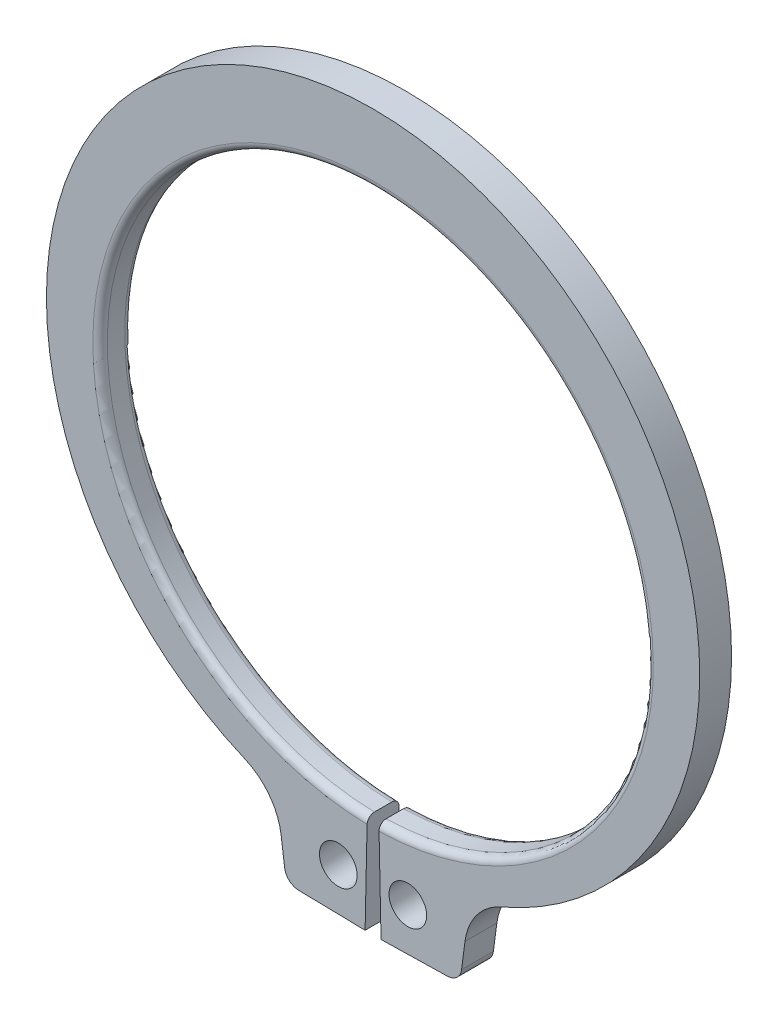
ISO-10303-21;
HEADER;
FILE_DESCRIPTION(('STEP AP214'),'2;1');
FILE_NAME('part.step','',(''),(''),'','','');
FILE_SCHEMA(('AUTOMOTIVE_DESIGN { 1 0 10303 214 1 1 1 1 }'));
ENDSEC;
DATA;
#1=APPLICATION_CONTEXT('core data for automotive mechanical design processes');
#2=APPLICATION_PROTOCOL_DEFINITION('international standard','automotive_design',2000,#1);
#3=PRODUCT_CONTEXT('',#1,'mechanical');
#4=PRODUCT('Part','Part','',(#3));
#5=PRODUCT_RELATED_PRODUCT_CATEGORY('part','',(#4));
#6=PRODUCT_DEFINITION_FORMATION('','',#4);
#7=PRODUCT_DEFINITION_CONTEXT('part definition',#1,'design');
#8=PRODUCT_DEFINITION('design','',#6,#7);
#9=PRODUCT_DEFINITION_SHAPE('','',#8);
#10=(LENGTH_UNIT() NAMED_UNIT(*) SI_UNIT(.MILLI.,.METRE.));
#11=(NAMED_UNIT(*) PLANE_ANGLE_UNIT() SI_UNIT($,.RADIAN.));
#12=(NAMED_UNIT(*) SI_UNIT($,.STERADIAN.) SOLID_ANGLE_UNIT());
#13=UNCERTAINTY_MEASURE_WITH_UNIT(LENGTH_MEASURE(1.E-05),#10,'distance_accuracy_value','');
#14=(GEOMETRIC_REPRESENTATION_CONTEXT(3) GLOBAL_UNCERTAINTY_ASSIGNED_CONTEXT((#13)) GLOBAL_UNIT_ASSIGNED_CONTEXT((#10,
#11,#12)) REPRESENTATION_CONTEXT('',''));
#15=CARTESIAN_POINT('',(0.,0.,0.));
#16=DIRECTION('',(0.,0.,1.));
#17=DIRECTION('',(1.,0.,0.));
#18=AXIS2_PLACEMENT_3D('',#15,#16,#17);
#19=CARTESIAN_POINT('',(0.626976767648557,0.778446285086579,-1.26977994725239));
#20=DIRECTION('',(0.,0.,1.));
#21=DIRECTION('',(1.,0.,0.));
#22=AXIS2_PLACEMENT_3D('',#19,#20,#21);
#23=CYLINDRICAL_SURFACE('',#22,9.425);
#24=DIRECTION('',(0.,0.,1.));
#25=VECTOR('',#24,1.);
#26=CARTESIAN_POINT('',(0.425666088036907,-8.64440354977094,-1.26977994725239));
#27=LINE('',#26,#25);
#28=CARTESIAN_POINT('',(0.425666088036907,-8.64440354977094,-1.01977994725239));
#29=VERTEX_POINT('',#28);
#30=CARTESIAN_POINT('',(0.425666088036907,-8.64440354977094,-0.419779947252391));
#31=VERTEX_POINT('',#30);
#32=EDGE_CURVE('E228',#29,#31,#27,.T.);
#33=ORIENTED_EDGE('',*,*,#32,.F.);
#34=CARTESIAN_POINT('',(0.626976767648557,0.778446285086579,-1.01977994725239));
#35=DIRECTION('',(0.,0.,1.));
#36=DIRECTION('',(1.,0.,0.));
#37=AXIS2_PLACEMENT_3D('',#34,#35,#36);
#38=CIRCLE('',#37,9.425);
#39=CARTESIAN_POINT('',(0.828287447260208,-8.64440354977094,-1.01977994725239));
#40=VERTEX_POINT('',#39);
#41=EDGE_CURVE('E251',#29,#40,#38,.F.);
#42=ORIENTED_EDGE('',*,*,#41,.T.);
#43=DIRECTION('',(0.,0.,1.));
#44=VECTOR('',#43,1.);
#45=CARTESIAN_POINT('',(0.828287447260208,-8.64440354977094,-1.26977994725239));
#46=LINE('',#45,#44);
#47=CARTESIAN_POINT('',(0.828287447260208,-8.64440354977094,-0.419779947252391));
#48=VERTEX_POINT('',#47);
#49=EDGE_CURVE('E165',#40,#48,#46,.T.);
#50=ORIENTED_EDGE('',*,*,#49,.T.);
#51=CARTESIAN_POINT('',(0.626976767648557,0.778446285086579,-0.419779947252391));
#52=DIRECTION('',(0.,0.,1.));
#53=DIRECTION('',(1.,0.,0.));
#54=AXIS2_PLACEMENT_3D('',#51,#52,#53);
#55=CIRCLE('',#54,9.425);
#56=EDGE_CURVE('E230',#48,#31,#55,.T.);
#57=ORIENTED_EDGE('',*,*,#56,.T.);
#58=EDGE_LOOP('',(#33,#42,#50,#57));
#59=FACE_BOUND('',#58,.T.);
#60=ADVANCED_FACE('F43',(#59),#23,.F.);
#61=CARTESIAN_POINT('',(0.425666088036907,-8.64440354977094,-1.26977994725239));
#62=DIRECTION('',(0.999771865767376,-0.0213592233009709,0.));
#63=DIRECTION('',(0.0213592233009709,0.999771865767376,0.));
#64=AXIS2_PLACEMENT_3D('',#61,#62,#63);
#65=PLANE('',#64);
#66=DIRECTION('',(0.0213592233009709,0.999771865767376,0.));
#67=VECTOR('',#66,1.);
#68=CARTESIAN_POINT('',(0.425666088036907,-8.64440354977094,-1.26977994725239));
#69=LINE('',#68,#67);
#70=CARTESIAN_POINT('',(0.351976767648557,-12.0936164866684,-1.26977994725239));
#71=VERTEX_POINT('',#70);
#72=CARTESIAN_POINT('',(0.420326282211664,-8.89434651621278,-1.26977994725239));
#73=VERTEX_POINT('',#72);
#74=EDGE_CURVE('E197',#71,#73,#69,.T.);
#75=ORIENTED_EDGE('',*,*,#74,.T.);
#76=CARTESIAN_POINT('',(0.420326282211664,-8.89434651621278,-1.01977994725239));
#77=DIRECTION('',(0.999771865767376,-0.0213592233009709,0.));
#78=DIRECTION('',(0.0213592233009709,0.999771865767376,0.));
#79=AXIS2_PLACEMENT_3D('',#76,#77,#78);
#80=CIRCLE('',#79,0.25);
#81=EDGE_CURVE('E51',#73,#29,#80,.T.);
#82=ORIENTED_EDGE('',*,*,#81,.T.);
#83=ORIENTED_EDGE('',*,*,#32,.T.);
#84=CARTESIAN_POINT('',(0.420326282211664,-8.89434651621278,-0.419779947252391));
#85=DIRECTION('',(0.999771865767376,-0.0213592233009709,0.));
#86=DIRECTION('',(0.0213592233009709,0.999771865767376,0.));
#87=AXIS2_PLACEMENT_3D('',#84,#85,#86);
#88=CIRCLE('',#87,0.25);
#89=CARTESIAN_POINT('',(0.420326282211664,-8.89434651621278,-0.169779947252391));
#90=VERTEX_POINT('',#89);
#91=EDGE_CURVE('E58',#31,#90,#88,.T.);
#92=ORIENTED_EDGE('',*,*,#91,.T.);
#93=DIRECTION('',(0.0213592233009709,0.999771865767376,0.));
#94=VECTOR('',#93,1.);
#95=CARTESIAN_POINT('',(0.425666088036907,-8.64440354977094,-0.169779947252391));
#96=LINE('',#95,#94);
#97=CARTESIAN_POINT('',(0.351976767648557,-12.0936164866684,-0.169779947252391));
#98=VERTEX_POINT('',#97);
#99=EDGE_CURVE('E157',#98,#90,#96,.T.);
#100=ORIENTED_EDGE('',*,*,#99,.F.);
#101=DIRECTION('',(0.,0.,1.));
#102=VECTOR('',#101,1.);
#103=CARTESIAN_POINT('',(0.351976767648557,-12.0936164866684,-1.26977994725239));
#104=LINE('',#103,#102);
#105=EDGE_CURVE('E231',#71,#98,#104,.T.);
#106=ORIENTED_EDGE('',*,*,#105,.F.);
#107=EDGE_LOOP('',(#75,#82,#83,#92,#100,#106));
#108=FACE_BOUND('',#107,.T.);
#109=ADVANCED_FACE('F260',(#108),#65,.T.);
#110=CARTESIAN_POINT('',(0.351976767648557,-12.0936164866684,-1.26977994725239));
#111=DIRECTION('',(-0.0213592233009698,-0.999771865767376,0.));
#112=DIRECTION('',(0.999771865767376,-0.0213592233009698,0.));
#113=AXIS2_PLACEMENT_3D('',#110,#111,#112);
#114=PLANE('',#113);
#115=DIRECTION('',(0.999771865767376,-0.0213592233009698,0.));
#116=VECTOR('',#115,1.);
#117=CARTESIAN_POINT('',(0.351976767648557,-12.0936164866684,-0.169779947252391));
#118=LINE('',#117,#116);
#119=CARTESIAN_POINT('',(-1.94180009482106,-12.0446120148627,-0.169779947252391));
#120=VERTEX_POINT('',#119);
#121=EDGE_CURVE('E224',#120,#98,#118,.T.);
#122=ORIENTED_EDGE('',*,*,#121,.F.);
#123=DIRECTION('',(0.,0.,1.));
#124=VECTOR('',#123,1.);
#125=CARTESIAN_POINT('',(-1.94180009482106,-12.0446120148627,-1.26977994725239));
#126=LINE('',#125,#124);
#127=CARTESIAN_POINT('',(-1.94180009482106,-12.0446120148627,-1.26977994725239));
#128=VERTEX_POINT('',#127);
#129=EDGE_CURVE('E233',#128,#120,#126,.T.);
#130=ORIENTED_EDGE('',*,*,#129,.F.);
#131=DIRECTION('',(0.999771865767376,-0.0213592233009698,0.));
#132=VECTOR('',#131,1.);
#133=CARTESIAN_POINT('',(0.351976767648557,-12.0936164866684,-1.26977994725239));
#134=LINE('',#133,#132);
#135=EDGE_CURVE('E194',#128,#71,#134,.T.);
#136=ORIENTED_EDGE('',*,*,#135,.T.);
#137=ORIENTED_EDGE('',*,*,#105,.T.);
#138=EDGE_LOOP('',(#122,#130,#136,#137));
#139=FACE_BOUND('',#138,.T.);
#140=ADVANCED_FACE('F283',(#139),#114,.T.);
#141=CARTESIAN_POINT('',(-1.93112048317058,-11.544726081979,-1.26977994725239));
#142=DIRECTION('',(0.,0.,1.));
#143=DIRECTION('',(1.,0.,0.));
#144=AXIS2_PLACEMENT_3D('',#141,#142,#143);
#145=CYLINDRICAL_SURFACE('',#144,0.499999999999999);
#146=CARTESIAN_POINT('',(-1.93112048317058,-11.544726081979,-0.169779947252391));
#147=DIRECTION('',(0.,0.,1.));
#148=DIRECTION('',(1.,0.,0.));
#149=AXIS2_PLACEMENT_3D('',#146,#147,#148);
#150=CIRCLE('',#149,0.499999999999999);
#151=CARTESIAN_POINT('',(-2.42684291385748,-11.6099891780891,-0.169779947252391));
#152=VERTEX_POINT('',#151);
#153=EDGE_CURVE('E221',#152,#120,#150,.T.);
#154=ORIENTED_EDGE('',*,*,#153,.F.);
#155=DIRECTION('',(0.,0.,1.));
#156=VECTOR('',#155,1.);
#157=CARTESIAN_POINT('',(-2.42684291385748,-11.6099891780891,-1.26977994725239));
#158=LINE('',#157,#156);
#159=CARTESIAN_POINT('',(-2.42684291385748,-11.6099891780891,-1.26977994725239));
#160=VERTEX_POINT('',#159);
#161=EDGE_CURVE('E235',#160,#152,#158,.T.);
#162=ORIENTED_EDGE('',*,*,#161,.F.);
#163=CARTESIAN_POINT('',(-1.93112048317058,-11.544726081979,-1.26977994725239));
#164=DIRECTION('',(0.,0.,1.));
#165=DIRECTION('',(1.,0.,0.));
#166=AXIS2_PLACEMENT_3D('',#163,#164,#165);
#167=CIRCLE('',#166,0.499999999999999);
#168=EDGE_CURVE('E191',#160,#128,#167,.T.);
#169=ORIENTED_EDGE('',*,*,#168,.T.);
#170=ORIENTED_EDGE('',*,*,#129,.T.);
#171=EDGE_LOOP('',(#154,#162,#169,#170));
#172=FACE_BOUND('',#171,.T.);
#173=ADVANCED_FACE('F313',(#172),#145,.T.);
#174=CARTESIAN_POINT('',(-2.54649092636189,-10.7011722950294,-1.26977994725239));
#175=DIRECTION('',(-0.99144486137381,-0.130526192220053,0.));
#176=DIRECTION('',(0.130526192220053,-0.99144486137381,0.));
#177=AXIS2_PLACEMENT_3D('',#174,#175,#176);
#178=PLANE('',#177);
#179=DIRECTION('',(0.130526192220053,-0.99144486137381,0.));
#180=VECTOR('',#179,1.);
#181=CARTESIAN_POINT('',(-2.54649092636189,-10.7011722950294,-0.169779947252391));
#182=LINE('',#181,#180);
#183=CARTESIAN_POINT('',(-2.54649092636189,-10.7011722950294,-0.169779947252391));
#184=VERTEX_POINT('',#183);
#185=EDGE_CURVE('E218',#184,#152,#182,.T.);
#186=ORIENTED_EDGE('',*,*,#185,.F.);
#187=DIRECTION('',(0.,0.,1.));
#188=VECTOR('',#187,1.);
#189=CARTESIAN_POINT('',(-2.54649092636189,-10.7011722950294,-1.26977994725239));
#190=LINE('',#189,#188);
#191=CARTESIAN_POINT('',(-2.54649092636189,-10.7011722950294,-1.26977994725239));
#192=VERTEX_POINT('',#191);
#193=EDGE_CURVE('E237',#192,#184,#190,.T.);
#194=ORIENTED_EDGE('',*,*,#193,.F.);
#195=DIRECTION('',(0.130526192220053,-0.99144486137381,0.));
#196=VECTOR('',#195,1.);
#197=CARTESIAN_POINT('',(-2.54649092636189,-10.7011722950294,-1.26977994725239));
#198=LINE('',#197,#196);
#199=EDGE_CURVE('E188',#192,#160,#198,.T.);
#200=ORIENTED_EDGE('',*,*,#199,.T.);
#201=ORIENTED_EDGE('',*,*,#161,.T.);
#202=EDGE_LOOP('',(#186,#194,#200,#201));
#203=FACE_BOUND('',#202,.T.);
#204=ADVANCED_FACE('F309',(#203),#178,.T.);
#205=CARTESIAN_POINT('',(-4.6281801757392,-10.9752318839107,-1.26977994725239));
#206=DIRECTION('',(0.,0.,1.));
#207=DIRECTION('',(1.,0.,0.));
#208=AXIS2_PLACEMENT_3D('',#205,#206,#207);
#209=CYLINDRICAL_SURFACE('',#208,2.09965206385032);
#210=CARTESIAN_POINT('',(-4.6281801757392,-10.9752318839107,-0.169779947252391));
#211=DIRECTION('',(0.,0.,-1.));
#212=DIRECTION('',(1.,0.,0.));
#213=AXIS2_PLACEMENT_3D('',#210,#211,#212);
#214=CIRCLE('',#213,2.09965206385032);
#215=CARTESIAN_POINT('',(-3.80332579314655,-9.04438905324101,-0.169779947252391));
#216=VERTEX_POINT('',#215);
#217=EDGE_CURVE('E215',#216,#184,#214,.T.);
#218=ORIENTED_EDGE('',*,*,#217,.F.);
#219=DIRECTION('',(0.,0.,1.));
#220=VECTOR('',#219,1.);
#221=CARTESIAN_POINT('',(-3.80332579314655,-9.04438905324101,-1.26977994725239));
#222=LINE('',#221,#220);
#223=CARTESIAN_POINT('',(-3.80332579314655,-9.04438905324101,-1.26977994725239));
#224=VERTEX_POINT('',#223);
#225=EDGE_CURVE('E239',#224,#216,#222,.T.);
#226=ORIENTED_EDGE('',*,*,#225,.F.);
#227=CARTESIAN_POINT('',(-4.6281801757392,-10.9752318839107,-1.26977994725239));
#228=DIRECTION('',(0.,0.,-1.));
#229=DIRECTION('',(1.,0.,0.));
#230=AXIS2_PLACEMENT_3D('',#227,#228,#229);
#231=CIRCLE('',#230,2.09965206385032);
#232=EDGE_CURVE('E185',#224,#192,#231,.T.);
#233=ORIENTED_EDGE('',*,*,#232,.T.);
#234=ORIENTED_EDGE('',*,*,#193,.T.);
#235=EDGE_LOOP('',(#218,#226,#233,#234));
#236=FACE_BOUND('',#235,.T.);
#237=ADVANCED_FACE('F305',(#236),#209,.F.);
#238=CARTESIAN_POINT('',(0.626976767648557,1.32619043052378,-1.26977994725239));
#239=DIRECTION('',(0.,0.,1.));
#240=DIRECTION('',(1.,0.,0.));
#241=AXIS2_PLACEMENT_3D('',#238,#239,#240);
#242=CYLINDRICAL_SURFACE('',#241,11.2772558545628);
#243=CARTESIAN_POINT('',(0.626976767648557,1.32619043052378,-0.169779947252391));
#244=DIRECTION('',(0.,0.,1.));
#245=DIRECTION('',(1.,0.,0.));
#246=AXIS2_PLACEMENT_3D('',#243,#244,#245);
#247=CIRCLE('',#246,11.2772558545628);
#248=CARTESIAN_POINT('',(5.05727932844366,-9.04438905324101,-0.169779947252391));
#249=VERTEX_POINT('',#248);
#250=EDGE_CURVE('E212',#249,#216,#247,.T.);
#251=ORIENTED_EDGE('',*,*,#250,.F.);
#252=DIRECTION('',(0.,0.,1.));
#253=VECTOR('',#252,1.);
#254=CARTESIAN_POINT('',(5.05727932844366,-9.04438905324101,-1.26977994725239));
#255=LINE('',#254,#253);
#256=CARTESIAN_POINT('',(5.05727932844366,-9.04438905324101,-1.26977994725239));
#257=VERTEX_POINT('',#256);
#258=EDGE_CURVE('E241',#257,#249,#255,.T.);
#259=ORIENTED_EDGE('',*,*,#258,.F.);
#260=CARTESIAN_POINT('',(0.626976767648557,1.32619043052378,-1.26977994725239));
#261=DIRECTION('',(0.,0.,1.));
#262=DIRECTION('',(1.,0.,0.));
#263=AXIS2_PLACEMENT_3D('',#260,#261,#262);
#264=CIRCLE('',#263,11.2772558545628);
#265=EDGE_CURVE('E182',#257,#224,#264,.T.);
#266=ORIENTED_EDGE('',*,*,#265,.T.);
#267=ORIENTED_EDGE('',*,*,#225,.T.);
#268=EDGE_LOOP('',(#251,#259,#266,#267));
#269=FACE_BOUND('',#268,.T.);
#270=ADVANCED_FACE('F301',(#269),#242,.T.);
#271=CARTESIAN_POINT('',(5.88213371103631,-10.9752318839107,-1.26977994725239));
#272=DIRECTION('',(0.,0.,1.));
#273=DIRECTION('',(1.,0.,0.));
#274=AXIS2_PLACEMENT_3D('',#271,#272,#273);
#275=CYLINDRICAL_SURFACE('',#274,2.09965206385032);
#276=CARTESIAN_POINT('',(5.88213371103631,-10.9752318839107,-0.169779947252391));
#277=DIRECTION('',(0.,0.,-1.));
#278=DIRECTION('',(1.,0.,0.));
#279=AXIS2_PLACEMENT_3D('',#276,#277,#278);
#280=CIRCLE('',#279,2.09965206385032);
#281=CARTESIAN_POINT('',(3.800444461659,-10.7011722950294,-0.169779947252391));
#282=VERTEX_POINT('',#281);
#283=EDGE_CURVE('E209',#282,#249,#280,.T.);
#284=ORIENTED_EDGE('',*,*,#283,.F.);
#285=DIRECTION('',(0.,0.,1.));
#286=VECTOR('',#285,1.);
#287=CARTESIAN_POINT('',(3.800444461659,-10.7011722950294,-1.26977994725239));
#288=LINE('',#287,#286);
#289=CARTESIAN_POINT('',(3.800444461659,-10.7011722950294,-1.26977994725239));
#290=VERTEX_POINT('',#289);
#291=EDGE_CURVE('E243',#290,#282,#288,.T.);
#292=ORIENTED_EDGE('',*,*,#291,.F.);
#293=CARTESIAN_POINT('',(5.88213371103631,-10.9752318839107,-1.26977994725239));
#294=DIRECTION('',(0.,0.,-1.));
#295=DIRECTION('',(1.,0.,0.));
#296=AXIS2_PLACEMENT_3D('',#293,#294,#295);
#297=CIRCLE('',#296,2.09965206385032);
#298=EDGE_CURVE('E179',#290,#257,#297,.T.);
#299=ORIENTED_EDGE('',*,*,#298,.T.);
#300=ORIENTED_EDGE('',*,*,#258,.T.);
#301=EDGE_LOOP('',(#284,#292,#299,#300));
#302=FACE_BOUND('',#301,.T.);
#303=ADVANCED_FACE('F297',(#302),#275,.F.);
#304=CARTESIAN_POINT('',(3.800444461659,-10.7011722950294,-1.26977994725239));
#305=DIRECTION('',(0.99144486137381,-0.130526192220053,0.));
#306=DIRECTION('',(0.130526192220053,0.99144486137381,0.));
#307=AXIS2_PLACEMENT_3D('',#304,#305,#306);
#308=PLANE('',#307);
#309=DIRECTION('',(0.130526192220053,0.99144486137381,0.));
#310=VECTOR('',#309,1.);
#311=CARTESIAN_POINT('',(3.800444461659,-10.7011722950294,-0.169779947252391));
#312=LINE('',#311,#310);
#313=CARTESIAN_POINT('',(3.6807964491546,-11.6099891780891,-0.169779947252391));
#314=VERTEX_POINT('',#313);
#315=EDGE_CURVE('E206',#314,#282,#312,.T.);
#316=ORIENTED_EDGE('',*,*,#315,.F.);
#317=DIRECTION('',(0.,0.,1.));
#318=VECTOR('',#317,1.);
#319=CARTESIAN_POINT('',(3.6807964491546,-11.6099891780891,-1.26977994725239));
#320=LINE('',#319,#318);
#321=CARTESIAN_POINT('',(3.6807964491546,-11.6099891780891,-1.26977994725239));
#322=VERTEX_POINT('',#321);
#323=EDGE_CURVE('E245',#322,#314,#320,.T.);
#324=ORIENTED_EDGE('',*,*,#323,.F.);
#325=DIRECTION('',(0.130526192220053,0.99144486137381,0.));
#326=VECTOR('',#325,1.);
#327=CARTESIAN_POINT('',(3.800444461659,-10.7011722950294,-1.26977994725239));
#328=LINE('',#327,#326);
#329=EDGE_CURVE('E173',#322,#290,#328,.T.);
#330=ORIENTED_EDGE('',*,*,#329,.T.);
#331=ORIENTED_EDGE('',*,*,#291,.T.);
#332=EDGE_LOOP('',(#316,#324,#330,#331));
#333=FACE_BOUND('',#332,.T.);
#334=ADVANCED_FACE('F293',(#333),#308,.T.);
#335=CARTESIAN_POINT('',(3.18507401846769,-11.544726081979,-1.26977994725239));
#336=DIRECTION('',(0.,0.,1.));
#337=DIRECTION('',(1.,0.,0.));
#338=AXIS2_PLACEMENT_3D('',#335,#336,#337);
#339=CYLINDRICAL_SURFACE('',#338,0.499999999999999);
#340=CARTESIAN_POINT('',(3.18507401846769,-11.544726081979,-0.169779947252391));
#341=DIRECTION('',(0.,0.,1.));
#342=DIRECTION('',(-1.,0.,0.));
#343=AXIS2_PLACEMENT_3D('',#340,#341,#342);
#344=CIRCLE('',#343,0.499999999999999);
#345=CARTESIAN_POINT('',(3.19575363011818,-12.0446120148627,-0.169779947252391));
#346=VERTEX_POINT('',#345);
#347=EDGE_CURVE('E203',#346,#314,#344,.T.);
#348=ORIENTED_EDGE('',*,*,#347,.F.);
#349=DIRECTION('',(0.,0.,1.));
#350=VECTOR('',#349,1.);
#351=CARTESIAN_POINT('',(3.19575363011818,-12.0446120148627,-1.26977994725239));
#352=LINE('',#351,#350);
#353=CARTESIAN_POINT('',(3.19575363011818,-12.0446120148627,-1.26977994725239));
#354=VERTEX_POINT('',#353);
#355=EDGE_CURVE('E164',#354,#346,#352,.T.);
#356=ORIENTED_EDGE('',*,*,#355,.F.);
#357=CARTESIAN_POINT('',(3.18507401846769,-11.544726081979,-1.26977994725239));
#358=DIRECTION('',(0.,0.,1.));
#359=DIRECTION('',(-1.,0.,0.));
#360=AXIS2_PLACEMENT_3D('',#357,#358,#359);
#361=CIRCLE('',#360,0.499999999999999);
#362=EDGE_CURVE('E171',#354,#322,#361,.T.);
#363=ORIENTED_EDGE('',*,*,#362,.T.);
#364=ORIENTED_EDGE('',*,*,#323,.T.);
#365=EDGE_LOOP('',(#348,#356,#363,#364));
#366=FACE_BOUND('',#365,.T.);
#367=ADVANCED_FACE('F290',(#366),#339,.T.);
#368=CARTESIAN_POINT('',(0.901976767648557,-12.0936164866684,-1.26977994725239));
#369=DIRECTION('',(0.0213592233009698,-0.999771865767376,0.));
#370=DIRECTION('',(0.999771865767376,0.0213592233009698,0.));
#371=AXIS2_PLACEMENT_3D('',#368,#369,#370);
#372=PLANE('',#371);
#373=DIRECTION('',(0.999771865767376,0.0213592233009698,0.));
#374=VECTOR('',#373,1.);
#375=CARTESIAN_POINT('',(0.901976767648557,-12.0936164866684,-0.169779947252391));
#376=LINE('',#375,#374);
#377=CARTESIAN_POINT('',(0.901976767648557,-12.0936164866684,-0.169779947252391));
#378=VERTEX_POINT('',#377);
#379=EDGE_CURVE('E163',#378,#346,#376,.T.);
#380=ORIENTED_EDGE('',*,*,#379,.F.);
#381=DIRECTION('',(0.,0.,1.));
#382=VECTOR('',#381,1.);
#383=CARTESIAN_POINT('',(0.901976767648557,-12.0936164866684,-1.26977994725239));
#384=LINE('',#383,#382);
#385=CARTESIAN_POINT('',(0.901976767648557,-12.0936164866684,-1.26977994725239));
#386=VERTEX_POINT('',#385);
#387=EDGE_CURVE('E152',#386,#378,#384,.T.);
#388=ORIENTED_EDGE('',*,*,#387,.F.);
#389=DIRECTION('',(0.999771865767376,0.0213592233009698,0.));
#390=VECTOR('',#389,1.);
#391=CARTESIAN_POINT('',(0.901976767648557,-12.0936164866684,-1.26977994725239));
#392=LINE('',#391,#390);
#393=EDGE_CURVE('E156',#386,#354,#392,.T.);
#394=ORIENTED_EDGE('',*,*,#393,.T.);
#395=ORIENTED_EDGE('',*,*,#355,.T.);
#396=EDGE_LOOP('',(#380,#388,#394,#395));
#397=FACE_BOUND('',#396,.T.);
#398=ADVANCED_FACE('F161',(#397),#372,.T.);
#399=CARTESIAN_POINT('',(0.828287447260208,-8.64440354977094,-1.26977994725239));
#400=DIRECTION('',(-0.999771865767376,-0.0213592233009709,0.));
#401=DIRECTION('',(0.0213592233009709,-0.999771865767376,0.));
#402=AXIS2_PLACEMENT_3D('',#399,#400,#401);
#403=PLANE('',#402);
#404=ORIENTED_EDGE('',*,*,#49,.F.);
#405=CARTESIAN_POINT('',(0.833627253085451,-8.89434651621278,-1.01977994725239));
#406=DIRECTION('',(-0.999771865767376,-0.0213592233009709,0.));
#407=DIRECTION('',(0.0213592233009709,-0.999771865767376,0.));
#408=AXIS2_PLACEMENT_3D('',#405,#406,#407);
#409=CIRCLE('',#408,0.25);
#410=CARTESIAN_POINT('',(0.83362725308545,-8.89434651621278,-1.26977994725239));
#411=VERTEX_POINT('',#410);
#412=EDGE_CURVE('E154',#40,#411,#409,.T.);
#413=ORIENTED_EDGE('',*,*,#412,.T.);
#414=DIRECTION('',(0.0213592233009709,-0.999771865767376,0.));
#415=VECTOR('',#414,1.);
#416=CARTESIAN_POINT('',(0.828287447260208,-8.64440354977094,-1.26977994725239));
#417=LINE('',#416,#415);
#418=EDGE_CURVE('E147',#411,#386,#417,.T.);
#419=ORIENTED_EDGE('',*,*,#418,.T.);
#420=ORIENTED_EDGE('',*,*,#387,.T.);
#421=DIRECTION('',(0.0213592233009709,-0.999771865767376,0.));
#422=VECTOR('',#421,1.);
#423=CARTESIAN_POINT('',(0.828287447260208,-8.64440354977094,-0.169779947252391));
#424=LINE('',#423,#422);
#425=CARTESIAN_POINT('',(0.83362725308545,-8.89434651621278,-0.169779947252391));
#426=VERTEX_POINT('',#425);
#427=EDGE_CURVE('E199',#426,#378,#424,.T.);
#428=ORIENTED_EDGE('',*,*,#427,.F.);
#429=CARTESIAN_POINT('',(0.833627253085451,-8.89434651621278,-0.419779947252391));
#430=DIRECTION('',(-0.999771865767376,-0.0213592233009709,0.));
#431=DIRECTION('',(0.0213592233009709,-0.999771865767376,0.));
#432=AXIS2_PLACEMENT_3D('',#429,#430,#431);
#433=CIRCLE('',#432,0.25);
#434=EDGE_CURVE('E254',#426,#48,#433,.T.);
#435=ORIENTED_EDGE('',*,*,#434,.T.);
#436=EDGE_LOOP('',(#404,#413,#419,#420,#428,#435));
#437=FACE_BOUND('',#436,.T.);
#438=ADVANCED_FACE('F150',(#437),#403,.T.);
#439=CARTESIAN_POINT('',(0.626976767648557,0.778446285086579,-1.26977994725239));
#440=DIRECTION('',(0.,0.,1.));
#441=DIRECTION('',(1.,0.,0.));
#442=AXIS2_PLACEMENT_3D('',#439,#440,#441);
#443=PLANE('',#442);
#444=CARTESIAN_POINT('',(-0.573023232351443,-10.5959286977421,-1.26977994725239));
#445=DIRECTION('',(0.,0.,1.));
#446=DIRECTION('',(1.,0.,0.));
#447=AXIS2_PLACEMENT_3D('',#444,#445,#446);
#448=CIRCLE('',#447,0.65);
#449=CARTESIAN_POINT('',(0.0769767676485569,-10.5959286977421,-1.26977994725239));
#450=VERTEX_POINT('',#449);
#451=EDGE_CURVE('E339',#450,#450,#448,.T.);
#452=ORIENTED_EDGE('',*,*,#451,.T.);
#453=EDGE_LOOP('',(#452));
#454=FACE_BOUND('',#453,.T.);
#455=CARTESIAN_POINT('',(1.82697676764856,-10.5959286977421,-1.26977994725239));
#456=DIRECTION('',(0.,0.,1.));
#457=DIRECTION('',(1.,0.,0.));
#458=AXIS2_PLACEMENT_3D('',#455,#456,#457);
#459=CIRCLE('',#458,0.65);
#460=CARTESIAN_POINT('',(2.47697676764856,-10.5959286977421,-1.26977994725239));
#461=VERTEX_POINT('',#460);
#462=EDGE_CURVE('E201',#461,#461,#459,.T.);
#463=ORIENTED_EDGE('',*,*,#462,.T.);
#464=EDGE_LOOP('',(#463));
#465=FACE_BOUND('',#464,.T.);
#466=ORIENTED_EDGE('',*,*,#418,.F.);
#467=CARTESIAN_POINT('',(0.626976767648557,0.778446285086579,-1.26977994725239));
#468=DIRECTION('',(0.,0.,1.));
#469=DIRECTION('',(1.,0.,0.));
#470=AXIS2_PLACEMENT_3D('',#467,#468,#469);
#471=CIRCLE('',#470,9.675);
#472=EDGE_CURVE('E66',#411,#73,#471,.T.);
#473=ORIENTED_EDGE('',*,*,#472,.T.);
#474=ORIENTED_EDGE('',*,*,#74,.F.);
#475=ORIENTED_EDGE('',*,*,#135,.F.);
#476=ORIENTED_EDGE('',*,*,#168,.F.);
#477=ORIENTED_EDGE('',*,*,#199,.F.);
#478=ORIENTED_EDGE('',*,*,#232,.F.);
#479=ORIENTED_EDGE('',*,*,#265,.F.);
#480=ORIENTED_EDGE('',*,*,#298,.F.);
#481=ORIENTED_EDGE('',*,*,#329,.F.);
#482=ORIENTED_EDGE('',*,*,#362,.F.);
#483=ORIENTED_EDGE('',*,*,#393,.F.);
#484=EDGE_LOOP('',(#466,#473,#474,#475,#476,#477,#478,#479,#480,#481,#482,#483));
#485=FACE_BOUND('',#484,.T.);
#486=ADVANCED_FACE('F168',(#454,#465,#485),#443,.F.);
#487=CARTESIAN_POINT('',(0.626976767648557,0.778446285086579,-0.169779947252391));
#488=DIRECTION('',(0.,0.,1.));
#489=DIRECTION('',(1.,0.,0.));
#490=AXIS2_PLACEMENT_3D('',#487,#488,#489);
#491=PLANE('',#490);
#492=CARTESIAN_POINT('',(-0.573023232351443,-10.5959286977421,-0.169779947252391));
#493=DIRECTION('',(0.,0.,1.));
#494=DIRECTION('',(1.,0.,0.));
#495=AXIS2_PLACEMENT_3D('',#492,#493,#494);
#496=CIRCLE('',#495,0.65);
#497=CARTESIAN_POINT('',(0.0769767676485569,-10.5959286977421,-0.169779947252391));
#498=VERTEX_POINT('',#497);
#499=EDGE_CURVE('E342',#498,#498,#496,.T.);
#500=ORIENTED_EDGE('',*,*,#499,.F.);
#501=EDGE_LOOP('',(#500));
#502=FACE_BOUND('',#501,.T.);
#503=CARTESIAN_POINT('',(1.82697676764856,-10.5959286977421,-0.169779947252391));
#504=DIRECTION('',(0.,0.,1.));
#505=DIRECTION('',(1.,0.,0.));
#506=AXIS2_PLACEMENT_3D('',#503,#504,#505);
#507=CIRCLE('',#506,0.65);
#508=CARTESIAN_POINT('',(2.47697676764856,-10.5959286977421,-0.169779947252391));
#509=VERTEX_POINT('',#508);
#510=EDGE_CURVE('E337',#509,#509,#507,.T.);
#511=ORIENTED_EDGE('',*,*,#510,.F.);
#512=EDGE_LOOP('',(#511));
#513=FACE_BOUND('',#512,.T.);
#514=ORIENTED_EDGE('',*,*,#99,.T.);
#515=CARTESIAN_POINT('',(0.626976767648557,0.778446285086579,-0.169779947252391));
#516=DIRECTION('',(0.,0.,1.));
#517=DIRECTION('',(1.,0.,0.));
#518=AXIS2_PLACEMENT_3D('',#515,#516,#517);
#519=CIRCLE('',#518,9.675);
#520=EDGE_CURVE('E11',#90,#426,#519,.F.);
#521=ORIENTED_EDGE('',*,*,#520,.T.);
#522=ORIENTED_EDGE('',*,*,#427,.T.);
#523=ORIENTED_EDGE('',*,*,#379,.T.);
#524=ORIENTED_EDGE('',*,*,#347,.T.);
#525=ORIENTED_EDGE('',*,*,#315,.T.);
#526=ORIENTED_EDGE('',*,*,#283,.T.);
#527=ORIENTED_EDGE('',*,*,#250,.T.);
#528=ORIENTED_EDGE('',*,*,#217,.T.);
#529=ORIENTED_EDGE('',*,*,#185,.T.);
#530=ORIENTED_EDGE('',*,*,#153,.T.);
#531=ORIENTED_EDGE('',*,*,#121,.T.);
#532=EDGE_LOOP('',(#514,#521,#522,#523,#524,#525,#526,#527,#528,#529,#530,#531));
#533=FACE_BOUND('',#532,.T.);
#534=ADVANCED_FACE('F321',(#502,#513,#533),#491,.T.);
#535=CARTESIAN_POINT('',(1.82697676764856,-10.5959286977421,-1.26977994725239));
#536=DIRECTION('',(0.,0.,1.));
#537=DIRECTION('',(1.,0.,0.));
#538=AXIS2_PLACEMENT_3D('',#535,#536,#537);
#539=CYLINDRICAL_SURFACE('',#538,0.65);
#540=ORIENTED_EDGE('',*,*,#462,.F.);
#541=EDGE_LOOP('',(#540));
#542=FACE_BOUND('',#541,.T.);
#543=ORIENTED_EDGE('',*,*,#510,.T.);
#544=EDGE_LOOP('',(#543));
#545=FACE_BOUND('',#544,.T.);
#546=ADVANCED_FACE('F274',(#542,#545),#539,.F.);
#547=CARTESIAN_POINT('',(-0.573023232351443,-10.5959286977421,-1.26977994725239));
#548=DIRECTION('',(0.,0.,1.));
#549=DIRECTION('',(1.,0.,0.));
#550=AXIS2_PLACEMENT_3D('',#547,#548,#549);
#551=CYLINDRICAL_SURFACE('',#550,0.65);
#552=ORIENTED_EDGE('',*,*,#451,.F.);
#553=EDGE_LOOP('',(#552));
#554=FACE_BOUND('',#553,.T.);
#555=ORIENTED_EDGE('',*,*,#499,.T.);
#556=EDGE_LOOP('',(#555));
#557=FACE_BOUND('',#556,.T.);
#558=ADVANCED_FACE('F267',(#554,#557),#551,.F.);
#559=CARTESIAN_POINT('',(0.626976767648557,0.778446285086579,-1.01977994725239));
#560=DIRECTION('',(0.,0.,1.));
#561=DIRECTION('',(1.,0.,0.));
#562=AXIS2_PLACEMENT_3D('',#559,#560,#561);
#563=TOROIDAL_SURFACE('',#562,9.675,0.25);
#564=ORIENTED_EDGE('',*,*,#81,.F.);
#565=ORIENTED_EDGE('',*,*,#472,.F.);
#566=ORIENTED_EDGE('',*,*,#412,.F.);
#567=ORIENTED_EDGE('',*,*,#41,.F.);
#568=EDGE_LOOP('',(#564,#565,#566,#567));
#569=FACE_BOUND('',#568,.T.);
#570=ADVANCED_FACE('F265',(#569),#563,.T.);
#571=CARTESIAN_POINT('',(0.626976767648557,0.778446285086579,-0.419779947252391));
#572=DIRECTION('',(0.,0.,1.));
#573=DIRECTION('',(1.,0.,0.));
#574=AXIS2_PLACEMENT_3D('',#571,#572,#573);
#575=TOROIDAL_SURFACE('',#574,9.675,0.25);
#576=ORIENTED_EDGE('',*,*,#91,.F.);
#577=ORIENTED_EDGE('',*,*,#56,.F.);
#578=ORIENTED_EDGE('',*,*,#434,.F.);
#579=ORIENTED_EDGE('',*,*,#520,.F.);
#580=EDGE_LOOP('',(#576,#577,#578,#579));
#581=FACE_BOUND('',#580,.T.);
#582=ADVANCED_FACE('F45',(#581),#575,.T.);
#583=CLOSED_SHELL('',(#60,#109,#140,#173,#204,#237,#270,#303,#334,#367,#398,#438,#486,#534,#546,
#558,#570,#582));
#584=MANIFOLD_SOLID_BREP('B2',#583);
#585=ADVANCED_BREP_SHAPE_REPRESENTATION('',(#18,#584),#14);
#586=SHAPE_DEFINITION_REPRESENTATION(#9,#585);
ENDSEC;
END-ISO-10303-21;
